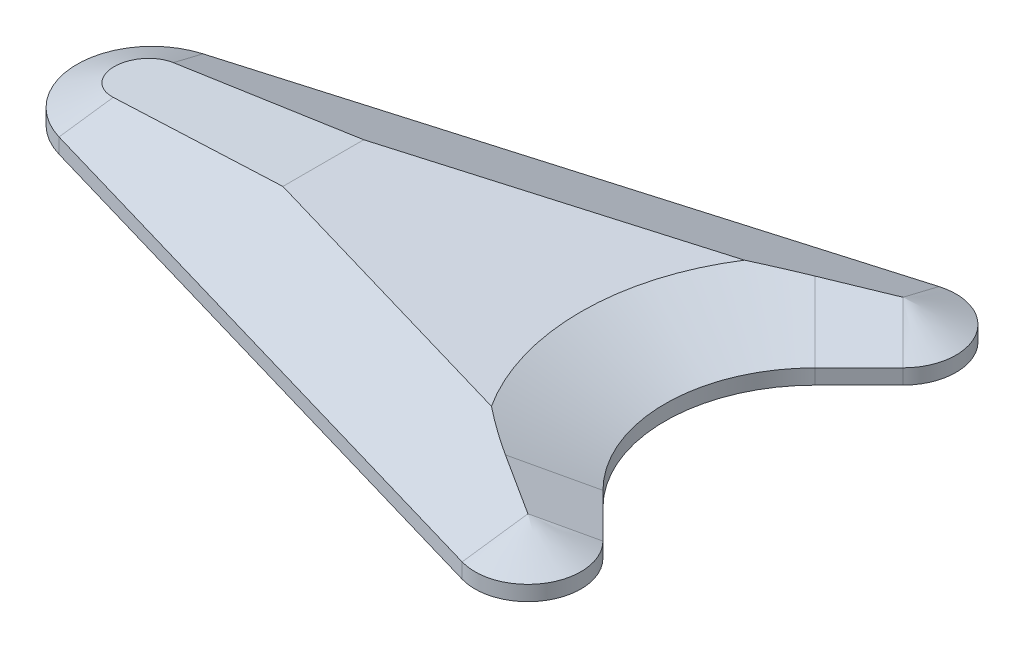
ISO-10303-21;
HEADER;
FILE_DESCRIPTION(('STEP AP214'),'2;1');
FILE_NAME('part.step','',(''),(''),'','','');
FILE_SCHEMA(('AUTOMOTIVE_DESIGN { 1 0 10303 214 1 1 1 1 }'));
ENDSEC;
DATA;
#1=APPLICATION_CONTEXT('core data for automotive mechanical design processes');
#2=APPLICATION_PROTOCOL_DEFINITION('international standard','automotive_design',2000,#1);
#3=PRODUCT_CONTEXT('',#1,'mechanical');
#4=PRODUCT('Part','Part','',(#3));
#5=PRODUCT_RELATED_PRODUCT_CATEGORY('part','',(#4));
#6=PRODUCT_DEFINITION_FORMATION('','',#4);
#7=PRODUCT_DEFINITION_CONTEXT('part definition',#1,'design');
#8=PRODUCT_DEFINITION('design','',#6,#7);
#9=PRODUCT_DEFINITION_SHAPE('','',#8);
#10=(LENGTH_UNIT() NAMED_UNIT(*) SI_UNIT(.MILLI.,.METRE.));
#11=(NAMED_UNIT(*) PLANE_ANGLE_UNIT() SI_UNIT($,.RADIAN.));
#12=(NAMED_UNIT(*) SI_UNIT($,.STERADIAN.) SOLID_ANGLE_UNIT());
#13=UNCERTAINTY_MEASURE_WITH_UNIT(LENGTH_MEASURE(1.E-05),#10,'distance_accuracy_value','');
#14=(GEOMETRIC_REPRESENTATION_CONTEXT(3) GLOBAL_UNCERTAINTY_ASSIGNED_CONTEXT((#13)) GLOBAL_UNIT_ASSIGNED_CONTEXT((#10,
#11,#12)) REPRESENTATION_CONTEXT('',''));
#15=CARTESIAN_POINT('',(0.,0.,0.));
#16=DIRECTION('',(0.,0.,1.));
#17=DIRECTION('',(1.,0.,0.));
#18=AXIS2_PLACEMENT_3D('',#15,#16,#17);
#19=CARTESIAN_POINT('',(53.2842712474619,-60.,0.));
#20=DIRECTION('',(0.,1.,0.));
#21=DIRECTION('',(0.,0.,1.));
#22=AXIS2_PLACEMENT_3D('',#19,#20,#21);
#23=CONICAL_SURFACE('',#22,20.,1.15191730631626);
#24=CARTESIAN_POINT('',(53.2842712474619,-60.,0.));
#25=DIRECTION('',(0.,-1.,0.));
#26=DIRECTION('',(0.,0.,1.));
#27=AXIS2_PLACEMENT_3D('',#24,#25,#26);
#28=CIRCLE('',#27,20.);
#29=CARTESIAN_POINT('',(39.1421356237309,-60.,14.1421356237309));
#30=VERTEX_POINT('',#29);
#31=CARTESIAN_POINT('',(39.142135623731,-60.,-14.1421356237309));
#32=VERTEX_POINT('',#31);
#33=EDGE_CURVE('E214',#30,#32,#28,.T.);
#34=ORIENTED_EDGE('',*,*,#33,.T.);
#35=DIRECTION('',(0.645974188021252,-0.406736643075799,0.645974188021251));
#36=VECTOR('',#35,1.);
#37=CARTESIAN_POINT('',(39.142135623731,-60.,-14.142135623731));
#38=LINE('',#37,#36);
#39=CARTESIAN_POINT('',(32.6430159087823,-55.9078393768281,-20.6412553386797));
#40=VERTEX_POINT('',#39);
#41=EDGE_CURVE('E220',#40,#32,#38,.T.);
#42=ORIENTED_EDGE('',*,*,#41,.F.);
#43=CARTESIAN_POINT('',(32.6430159087823,-55.9078393768281,-20.6412553386797));
#44=CARTESIAN_POINT('',(32.1545509946814,-55.8451711070328,-20.3518645541273));
#45=CARTESIAN_POINT('',(31.6705197188067,-55.7790804420419,-20.0557611073394));
#46=CARTESIAN_POINT('',(30.7118824899162,-55.640360342523,-19.4510080550057));
#47=CARTESIAN_POINT('',(30.2372690154023,-55.567736405331,-19.1423691150541));
#48=CARTESIAN_POINT('',(29.2972429077265,-55.4161556918258,-18.5129613476467));
#49=CARTESIAN_POINT('',(28.831829641351,-55.3371993532514,-18.1921933594423));
#50=CARTESIAN_POINT('',(27.9098655957101,-55.1731376492974,-17.5388587328563));
#51=CARTESIAN_POINT('',(27.4533225348792,-55.088027208426,-17.2062824735404));
#52=CARTESIAN_POINT('',(27.001450685154,-55.,-16.8682461392293));
#53=B_SPLINE_CURVE_WITH_KNOTS('',3,(#43,#44,#45,#46,#47,#48,#49,#50,#51,#52),.UNSPECIFIED.,.F.,
.F.,(4,2,2,2,4),(0.,1.71351909201226,3.4256096161592,5.1375818907686,6.85098255398824),.UNSPECIFIED.);
#54=CARTESIAN_POINT('',(27.001450685154,-55.,-16.8682461392293));
#55=VERTEX_POINT('',#54);
#56=EDGE_CURVE('E156',#40,#55,#53,.T.);
#57=ORIENTED_EDGE('',*,*,#56,.T.);
#58=CARTESIAN_POINT('',(53.2842712474619,-55.,0.));
#59=DIRECTION('',(0.,1.,0.));
#60=DIRECTION('',(0.,0.,1.));
#61=AXIS2_PLACEMENT_3D('',#58,#59,#60);
#62=CIRCLE('',#61,31.2301838695211);
#63=CARTESIAN_POINT('',(27.001450685154,-55.,16.8682461392293));
#64=VERTEX_POINT('',#63);
#65=EDGE_CURVE('E141',#64,#55,#62,.F.);
#66=ORIENTED_EDGE('',*,*,#65,.F.);
#67=CARTESIAN_POINT('',(32.6430159087822,-55.9078393768281,20.6412553386797));
#68=CARTESIAN_POINT('',(32.1545509946812,-55.8451711070328,20.3518645541273));
#69=CARTESIAN_POINT('',(31.6705197188066,-55.7790804420419,20.0557611073394));
#70=CARTESIAN_POINT('',(30.7118824899161,-55.640360342523,19.4510080550057));
#71=CARTESIAN_POINT('',(30.2372690154022,-55.567736405331,19.1423691150541));
#72=CARTESIAN_POINT('',(29.2972429077264,-55.4161556918258,18.5129613476467));
#73=CARTESIAN_POINT('',(28.831829641351,-55.3371993532514,18.1921933594423));
#74=CARTESIAN_POINT('',(27.9098655957101,-55.1731376492974,17.5388587328563));
#75=CARTESIAN_POINT('',(27.4533225348792,-55.088027208426,17.2062824735404));
#76=CARTESIAN_POINT('',(27.001450685154,-55.,16.8682461392293));
#77=B_SPLINE_CURVE_WITH_KNOTS('',3,(#67,#68,#69,#70,#71,#72,#73,#74,#75,#76),.UNSPECIFIED.,.F.,
.F.,(4,2,2,2,4),(0.,1.71351909201223,3.42560961615913,5.13758189076849,6.85098255398811),.UNSPECIFIED.);
#78=CARTESIAN_POINT('',(32.6430159087822,-55.9078393768281,20.6412553386797));
#79=VERTEX_POINT('',#78);
#80=EDGE_CURVE('E42',#79,#64,#77,.T.);
#81=ORIENTED_EDGE('',*,*,#80,.F.);
#82=DIRECTION('',(0.645974188021248,-0.406736643075799,-0.645974188021255));
#83=VECTOR('',#82,1.);
#84=CARTESIAN_POINT('',(39.142135623731,-60.,14.142135623731));
#85=LINE('',#84,#83);
#86=EDGE_CURVE('E144',#79,#30,#85,.T.);
#87=ORIENTED_EDGE('',*,*,#86,.T.);
#88=EDGE_LOOP('',(#34,#42,#57,#66,#81,#87));
#89=FACE_BOUND('',#88,.T.);
#90=ADVANCED_FACE('F34',(#89),#23,.F.);
#91=CARTESIAN_POINT('',(45.,-60.,-20.));
#92=DIRECTION('',(0.28760623847595,0.913545457642601,0.28760623847595));
#93=DIRECTION('',(-0.953846680434026,0.300294039609496,0.));
#94=AXIS2_PLACEMENT_3D('',#91,#92,#93);
#95=PLANE('',#94);
#96=DIRECTION('',(0.707106781186547,0.,-0.707106781186548));
#97=VECTOR('',#96,1.);
#98=CARTESIAN_POINT('',(45.,-60.,-20.));
#99=LINE('',#98,#97);
#100=CARTESIAN_POINT('',(45.,-60.,-20.));
#101=VERTEX_POINT('',#100);
#102=EDGE_CURVE('E240',#32,#101,#99,.T.);
#103=ORIENTED_EDGE('',*,*,#102,.T.);
#104=DIRECTION('',(0.645974188021251,-0.406736643075799,0.645974188021251));
#105=VECTOR('',#104,1.);
#106=CARTESIAN_POINT('',(45.,-60.,-20.));
#107=LINE('',#106,#105);
#108=CARTESIAN_POINT('',(40.,-56.8517577743956,-25.));
#109=VERTEX_POINT('',#108);
#110=EDGE_CURVE('E231',#109,#101,#107,.T.);
#111=ORIENTED_EDGE('',*,*,#110,.F.);
#112=DIRECTION('',(0.855146218786732,-0.109717275246884,-0.506642935416211));
#113=VECTOR('',#112,1.);
#114=CARTESIAN_POINT('',(41.7854879892184,-57.0808400913835,-26.0578364917423));
#115=LINE('',#114,#113);
#116=EDGE_CURVE('E229',#40,#109,#115,.T.);
#117=ORIENTED_EDGE('',*,*,#116,.F.);
#118=ORIENTED_EDGE('',*,*,#41,.T.);
#119=EDGE_LOOP('',(#103,#111,#117,#118));
#120=FACE_BOUND('',#119,.T.);
#121=ADVANCED_FACE('F36',(#120),#95,.T.);
#122=CARTESIAN_POINT('',(40.,-60.,-25.));
#123=DIRECTION('',(0.,-1.,0.));
#124=DIRECTION('',(0.,0.,1.));
#125=AXIS2_PLACEMENT_3D('',#122,#123,#124);
#126=CONICAL_SURFACE('',#125,7.07106781186547,1.15191730631626);
#127=DIRECTION('',(-0.256254702071103,-0.406736643075799,-0.876868764893516));
#128=VECTOR('',#127,1.);
#129=CARTESIAN_POINT('',(38.016525220179,-60.,-31.7871811378373));
#130=LINE('',#129,#128);
#131=CARTESIAN_POINT('',(38.016525220179,-60.,-31.7871811378372));
#132=VERTEX_POINT('',#131);
#133=EDGE_CURVE('E228',#109,#132,#130,.T.);
#134=ORIENTED_EDGE('',*,*,#133,.F.);
#135=ORIENTED_EDGE('',*,*,#110,.T.);
#136=CARTESIAN_POINT('',(40.,-60.,-25.));
#137=DIRECTION('',(0.,1.,0.));
#138=DIRECTION('',(0.,0.,1.));
#139=AXIS2_PLACEMENT_3D('',#136,#137,#138);
#140=CIRCLE('',#139,7.07106781186547);
#141=EDGE_CURVE('E243',#101,#132,#140,.T.);
#142=ORIENTED_EDGE('',*,*,#141,.T.);
#143=EDGE_LOOP('',(#134,#135,#142));
#144=FACE_BOUND('',#143,.T.);
#145=ADVANCED_FACE('F175',(#144),#126,.T.);
#146=CARTESIAN_POINT('',(38.016525220179,-60.,-31.7871811378373));
#147=DIRECTION('',(-0.114091944107248,0.913545457642601,-0.390407127381659));
#148=DIRECTION('',(0.,0.392973165535399,0.919549939464458));
#149=AXIS2_PLACEMENT_3D('',#146,#147,#148);
#150=PLANE('',#149);
#151=DIRECTION('',(-0.256254702071103,-0.406736643075799,-0.876868764893516));
#152=VECTOR('',#151,1.);
#153=CARTESIAN_POINT('',(-37.9100453327991,-60.,-9.5985236154123));
#154=LINE('',#153,#152);
#155=CARTESIAN_POINT('',(-36.2764970539792,-57.4071736523879,-4.00874340819776));
#156=VERTEX_POINT('',#155);
#157=CARTESIAN_POINT('',(-37.9100453327991,-60.,-9.59852361541229));
#158=VERTEX_POINT('',#157);
#159=EDGE_CURVE('E136',#156,#158,#154,.T.);
#160=ORIENTED_EDGE('',*,*,#159,.F.);
#161=DIRECTION('',(-0.99338106693742,-0.0996400462277655,0.0571482024039409));
#162=VECTOR('',#161,1.);
#163=CARTESIAN_POINT('',(38.3566399013138,-49.9211751127992,-8.30231186718958));
#164=LINE('',#163,#162);
#165=CARTESIAN_POINT('',(-12.2777051862331,-55.,-5.38936949495851));
#166=VERTEX_POINT('',#165);
#167=EDGE_CURVE('E128',#156,#166,#164,.F.);
#168=ORIENTED_EDGE('',*,*,#167,.T.);
#169=DIRECTION('',(0.959852361541231,0.,-0.280505693424788));
#170=VECTOR('',#169,1.);
#171=CARTESIAN_POINT('',(41.1666557337869,-55.,-21.0078626301352));
#172=LINE('',#171,#170);
#173=EDGE_CURVE('E134',#55,#166,#172,.F.);
#174=ORIENTED_EDGE('',*,*,#173,.F.);
#175=ORIENTED_EDGE('',*,*,#56,.F.);
#176=ORIENTED_EDGE('',*,*,#116,.T.);
#177=ORIENTED_EDGE('',*,*,#133,.T.);
#178=DIRECTION('',(-0.959852361541232,0.,0.280505693424788));
#179=VECTOR('',#178,1.);
#180=CARTESIAN_POINT('',(38.016525220179,-60.,-31.7871811378373));
#181=LINE('',#180,#179);
#182=EDGE_CURVE('E245',#132,#158,#181,.T.);
#183=ORIENTED_EDGE('',*,*,#182,.T.);
#184=EDGE_LOOP('',(#160,#168,#174,#175,#176,#177,#183));
#185=FACE_BOUND('',#184,.T.);
#186=ADVANCED_FACE('F133',(#185),#150,.T.);
#187=CARTESIAN_POINT('',(-35.1049883985512,-60.,0.));
#188=DIRECTION('',(0.,-1.,0.));
#189=DIRECTION('',(0.,0.,1.));
#190=AXIS2_PLACEMENT_3D('',#187,#188,#189);
#191=CONICAL_SURFACE('',#190,9.99999999999999,1.15191730631626);
#192=DIRECTION('',(-0.256254702071103,-0.406736643075799,0.876868764893516));
#193=VECTOR('',#192,1.);
#194=CARTESIAN_POINT('',(-37.9100453327991,-60.,9.59852361541232));
#195=LINE('',#194,#193);
#196=CARTESIAN_POINT('',(-36.2764970539792,-57.4071736523879,4.00874340819778));
#197=VERTEX_POINT('',#196);
#198=CARTESIAN_POINT('',(-37.9100453327991,-60.,9.59852361541231));
#199=VERTEX_POINT('',#198);
#200=EDGE_CURVE('E225',#197,#199,#195,.T.);
#201=ORIENTED_EDGE('',*,*,#200,.F.);
#202=CARTESIAN_POINT('',(-36.0335474732541,-57.382804849458,0.));
#203=DIRECTION('',(0.0998031539211447,-0.995007201213837,0.));
#204=DIRECTION('',(-0.995007201213837,-0.0998031539211447,0.));
#205=AXIS2_PLACEMENT_3D('',#202,#203,#204);
#206=ELLIPSE('',#205,4.1423654445624,4.01572564866542);
#207=EDGE_CURVE('E138',#197,#156,#206,.T.);
#208=ORIENTED_EDGE('',*,*,#207,.T.);
#209=ORIENTED_EDGE('',*,*,#159,.T.);
#210=CARTESIAN_POINT('',(-35.1049883985512,-60.,0.));
#211=DIRECTION('',(0.,1.,0.));
#212=DIRECTION('',(0.,0.,1.));
#213=AXIS2_PLACEMENT_3D('',#210,#211,#212);
#214=CIRCLE('',#213,9.99999999999999);
#215=EDGE_CURVE('E252',#158,#199,#214,.T.);
#216=ORIENTED_EDGE('',*,*,#215,.T.);
#217=EDGE_LOOP('',(#201,#208,#209,#216));
#218=FACE_BOUND('',#217,.T.);
#219=ADVANCED_FACE('F174',(#218),#191,.T.);
#220=CARTESIAN_POINT('',(38.016525220179,-60.,31.7871811378373));
#221=DIRECTION('',(-0.114091944107248,0.913545457642601,0.390407127381659));
#222=DIRECTION('',(0.,-0.392973165535398,0.919549939464458));
#223=AXIS2_PLACEMENT_3D('',#220,#221,#222);
#224=PLANE('',#223);
#225=DIRECTION('',(-0.959852361541231,0.,-0.280505693424788));
#226=VECTOR('',#225,1.);
#227=CARTESIAN_POINT('',(41.1666557337869,-55.,21.0078626301352));
#228=LINE('',#227,#226);
#229=CARTESIAN_POINT('',(-12.2777051862331,-55.,5.38936949495851));
#230=VERTEX_POINT('',#229);
#231=EDGE_CURVE('E55',#230,#64,#228,.F.);
#232=ORIENTED_EDGE('',*,*,#231,.F.);
#233=DIRECTION('',(0.99338106693742,0.0996400462277655,0.057148202403941));
#234=VECTOR('',#233,1.);
#235=CARTESIAN_POINT('',(38.3566399013138,-49.9211751127992,8.30231186718959));
#236=LINE('',#235,#234);
#237=EDGE_CURVE('E48',#230,#197,#236,.F.);
#238=ORIENTED_EDGE('',*,*,#237,.T.);
#239=ORIENTED_EDGE('',*,*,#200,.T.);
#240=DIRECTION('',(0.959852361541231,0.,0.280505693424788));
#241=VECTOR('',#240,1.);
#242=CARTESIAN_POINT('',(38.016525220179,-60.,31.7871811378373));
#243=LINE('',#242,#241);
#244=CARTESIAN_POINT('',(38.016525220179,-60.,31.7871811378372));
#245=VERTEX_POINT('',#244);
#246=EDGE_CURVE('E255',#199,#245,#243,.T.);
#247=ORIENTED_EDGE('',*,*,#246,.T.);
#248=DIRECTION('',(-0.256254702071103,-0.406736643075799,0.876868764893516));
#249=VECTOR('',#248,1.);
#250=CARTESIAN_POINT('',(38.016525220179,-60.,31.7871811378373));
#251=LINE('',#250,#249);
#252=CARTESIAN_POINT('',(40.,-56.8517577743956,25.));
#253=VERTEX_POINT('',#252);
#254=EDGE_CURVE('E221',#253,#245,#251,.T.);
#255=ORIENTED_EDGE('',*,*,#254,.F.);
#256=DIRECTION('',(0.855146218786732,-0.109717275246884,0.506642935416211));
#257=VECTOR('',#256,1.);
#258=CARTESIAN_POINT('',(41.7854879892184,-57.0808400913835,26.0578364917423));
#259=LINE('',#258,#257);
#260=EDGE_CURVE('E216',#79,#253,#259,.T.);
#261=ORIENTED_EDGE('',*,*,#260,.F.);
#262=ORIENTED_EDGE('',*,*,#80,.T.);
#263=EDGE_LOOP('',(#232,#238,#239,#247,#255,#261,#262));
#264=FACE_BOUND('',#263,.T.);
#265=ADVANCED_FACE('F163',(#264),#224,.T.);
#266=CARTESIAN_POINT('',(40.,-60.,25.));
#267=DIRECTION('',(0.,-1.,0.));
#268=DIRECTION('',(0.,0.,-1.));
#269=AXIS2_PLACEMENT_3D('',#266,#267,#268);
#270=CONICAL_SURFACE('',#269,7.07106781186547,1.15191730631626);
#271=DIRECTION('',(0.645974188021252,-0.406736643075799,-0.64597418802125));
#272=VECTOR('',#271,1.);
#273=CARTESIAN_POINT('',(45.,-60.,20.));
#274=LINE('',#273,#272);
#275=CARTESIAN_POINT('',(45.,-60.,20.));
#276=VERTEX_POINT('',#275);
#277=EDGE_CURVE('E206',#253,#276,#274,.T.);
#278=ORIENTED_EDGE('',*,*,#277,.F.);
#279=ORIENTED_EDGE('',*,*,#254,.T.);
#280=CARTESIAN_POINT('',(40.,-60.,25.));
#281=DIRECTION('',(0.,1.,0.));
#282=DIRECTION('',(0.,0.,-1.));
#283=AXIS2_PLACEMENT_3D('',#280,#281,#282);
#284=CIRCLE('',#283,7.07106781186547);
#285=EDGE_CURVE('E209',#245,#276,#284,.T.);
#286=ORIENTED_EDGE('',*,*,#285,.T.);
#287=EDGE_LOOP('',(#278,#279,#286));
#288=FACE_BOUND('',#287,.T.);
#289=ADVANCED_FACE('F189',(#288),#270,.T.);
#290=CARTESIAN_POINT('',(45.,-60.,20.));
#291=DIRECTION('',(0.28760623847595,0.913545457642601,-0.28760623847595));
#292=DIRECTION('',(-0.953846680434026,0.300294039609496,0.));
#293=AXIS2_PLACEMENT_3D('',#290,#291,#292);
#294=PLANE('',#293);
#295=DIRECTION('',(-0.707106781186546,0.,-0.707106781186548));
#296=VECTOR('',#295,1.);
#297=CARTESIAN_POINT('',(45.,-60.,20.));
#298=LINE('',#297,#296);
#299=EDGE_CURVE('E145',#276,#30,#298,.T.);
#300=ORIENTED_EDGE('',*,*,#299,.T.);
#301=ORIENTED_EDGE('',*,*,#86,.F.);
#302=ORIENTED_EDGE('',*,*,#260,.T.);
#303=ORIENTED_EDGE('',*,*,#277,.T.);
#304=EDGE_LOOP('',(#300,#301,#302,#303));
#305=FACE_BOUND('',#304,.T.);
#306=ADVANCED_FACE('F191',(#305),#294,.T.);
#307=CARTESIAN_POINT('',(53.2842712474619,-55.,0.));
#308=DIRECTION('',(0.,1.,0.));
#309=DIRECTION('',(0.,0.,1.));
#310=AXIS2_PLACEMENT_3D('',#307,#308,#309);
#311=PLANE('',#310);
#312=DIRECTION('',(0.,0.,-1.));
#313=VECTOR('',#312,1.);
#314=CARTESIAN_POINT('',(-12.2777051862331,-55.,0.));
#315=LINE('',#314,#313);
#316=EDGE_CURVE('E11',#230,#166,#315,.T.);
#317=ORIENTED_EDGE('',*,*,#316,.F.);
#318=ORIENTED_EDGE('',*,*,#231,.T.);
#319=ORIENTED_EDGE('',*,*,#65,.T.);
#320=ORIENTED_EDGE('',*,*,#173,.T.);
#321=EDGE_LOOP('',(#317,#318,#319,#320));
#322=FACE_BOUND('',#321,.T.);
#323=ADVANCED_FACE('F140',(#322),#311,.T.);
#324=CARTESIAN_POINT('',(53.2842712474619,-62.,0.));
#325=DIRECTION('',(0.,1.,0.));
#326=DIRECTION('',(0.,0.,1.));
#327=AXIS2_PLACEMENT_3D('',#324,#325,#326);
#328=CYLINDRICAL_SURFACE('',#327,20.);
#329=ORIENTED_EDGE('',*,*,#33,.F.);
#330=DIRECTION('',(0.,1.,0.));
#331=VECTOR('',#330,1.);
#332=CARTESIAN_POINT('',(39.1421356237309,-62.,14.1421356237309));
#333=LINE('',#332,#331);
#334=CARTESIAN_POINT('',(39.1421356237309,-62.,14.1421356237309));
#335=VERTEX_POINT('',#334);
#336=EDGE_CURVE('E247',#335,#30,#333,.T.);
#337=ORIENTED_EDGE('',*,*,#336,.F.);
#338=CARTESIAN_POINT('',(53.2842712474619,-62.,0.));
#339=DIRECTION('',(0.,-1.,0.));
#340=DIRECTION('',(0.,0.,1.));
#341=AXIS2_PLACEMENT_3D('',#338,#339,#340);
#342=CIRCLE('',#341,20.);
#343=CARTESIAN_POINT('',(39.142135623731,-62.,-14.1421356237309));
#344=VERTEX_POINT('',#343);
#345=EDGE_CURVE('E137',#335,#344,#342,.T.);
#346=ORIENTED_EDGE('',*,*,#345,.T.);
#347=DIRECTION('',(0.,1.,0.));
#348=VECTOR('',#347,1.);
#349=CARTESIAN_POINT('',(39.142135623731,-62.,-14.1421356237309));
#350=LINE('',#349,#348);
#351=EDGE_CURVE('E283',#344,#32,#350,.T.);
#352=ORIENTED_EDGE('',*,*,#351,.T.);
#353=EDGE_LOOP('',(#329,#337,#346,#352));
#354=FACE_BOUND('',#353,.T.);
#355=ADVANCED_FACE('F198',(#354),#328,.F.);
#356=CARTESIAN_POINT('',(45.,-62.,20.));
#357=DIRECTION('',(0.707106781186548,0.,-0.707106781186547));
#358=DIRECTION('',(-0.707106781186547,0.,-0.707106781186548));
#359=AXIS2_PLACEMENT_3D('',#356,#357,#358);
#360=PLANE('',#359);
#361=ORIENTED_EDGE('',*,*,#299,.F.);
#362=DIRECTION('',(0.,1.,0.));
#363=VECTOR('',#362,1.);
#364=CARTESIAN_POINT('',(45.,-62.,20.));
#365=LINE('',#364,#363);
#366=CARTESIAN_POINT('',(45.,-62.,20.));
#367=VERTEX_POINT('',#366);
#368=EDGE_CURVE('E265',#367,#276,#365,.T.);
#369=ORIENTED_EDGE('',*,*,#368,.F.);
#370=DIRECTION('',(-0.707106781186547,0.,-0.707106781186548));
#371=VECTOR('',#370,1.);
#372=CARTESIAN_POINT('',(45.,-62.,20.));
#373=LINE('',#372,#371);
#374=EDGE_CURVE('E284',#367,#335,#373,.T.);
#375=ORIENTED_EDGE('',*,*,#374,.T.);
#376=ORIENTED_EDGE('',*,*,#336,.T.);
#377=EDGE_LOOP('',(#361,#369,#375,#376));
#378=FACE_BOUND('',#377,.T.);
#379=ADVANCED_FACE('F326',(#378),#360,.T.);
#380=CARTESIAN_POINT('',(40.,-62.,25.));
#381=DIRECTION('',(0.,1.,0.));
#382=DIRECTION('',(0.,0.,1.));
#383=AXIS2_PLACEMENT_3D('',#380,#381,#382);
#384=CYLINDRICAL_SURFACE('',#383,7.07106781186546);
#385=ORIENTED_EDGE('',*,*,#285,.F.);
#386=DIRECTION('',(0.,1.,0.));
#387=VECTOR('',#386,1.);
#388=CARTESIAN_POINT('',(38.016525220179,-62.,31.7871811378372));
#389=LINE('',#388,#387);
#390=CARTESIAN_POINT('',(38.016525220179,-62.,31.7871811378372));
#391=VERTEX_POINT('',#390);
#392=EDGE_CURVE('E263',#391,#245,#389,.T.);
#393=ORIENTED_EDGE('',*,*,#392,.F.);
#394=CARTESIAN_POINT('',(40.,-62.,25.));
#395=DIRECTION('',(0.,1.,0.));
#396=DIRECTION('',(0.,0.,-1.));
#397=AXIS2_PLACEMENT_3D('',#394,#395,#396);
#398=CIRCLE('',#397,7.07106781186546);
#399=EDGE_CURVE('E266',#391,#367,#398,.T.);
#400=ORIENTED_EDGE('',*,*,#399,.T.);
#401=ORIENTED_EDGE('',*,*,#368,.T.);
#402=EDGE_LOOP('',(#385,#393,#400,#401));
#403=FACE_BOUND('',#402,.T.);
#404=ADVANCED_FACE('F261',(#403),#384,.T.);
#405=CARTESIAN_POINT('',(38.016525220179,-62.,31.7871811378372));
#406=DIRECTION('',(-0.280505693424788,0.,0.959852361541232));
#407=DIRECTION('',(0.959852361541232,0.,0.280505693424788));
#408=AXIS2_PLACEMENT_3D('',#405,#406,#407);
#409=PLANE('',#408);
#410=ORIENTED_EDGE('',*,*,#246,.F.);
#411=DIRECTION('',(0.,1.,0.));
#412=VECTOR('',#411,1.);
#413=CARTESIAN_POINT('',(-37.9100453327991,-62.,9.59852361541231));
#414=LINE('',#413,#412);
#415=CARTESIAN_POINT('',(-37.9100453327991,-62.,9.59852361541231));
#416=VERTEX_POINT('',#415);
#417=EDGE_CURVE('E271',#416,#199,#414,.T.);
#418=ORIENTED_EDGE('',*,*,#417,.F.);
#419=DIRECTION('',(0.959852361541231,0.,0.280505693424788));
#420=VECTOR('',#419,1.);
#421=CARTESIAN_POINT('',(38.016525220179,-62.,31.7871811378372));
#422=LINE('',#421,#420);
#423=EDGE_CURVE('E287',#416,#391,#422,.T.);
#424=ORIENTED_EDGE('',*,*,#423,.T.);
#425=ORIENTED_EDGE('',*,*,#392,.T.);
#426=EDGE_LOOP('',(#410,#418,#424,#425));
#427=FACE_BOUND('',#426,.T.);
#428=ADVANCED_FACE('F333',(#427),#409,.T.);
#429=CARTESIAN_POINT('',(-35.1049883985512,-62.,0.));
#430=DIRECTION('',(0.,1.,0.));
#431=DIRECTION('',(0.,0.,1.));
#432=AXIS2_PLACEMENT_3D('',#429,#430,#431);
#433=CYLINDRICAL_SURFACE('',#432,9.99999999999999);
#434=ORIENTED_EDGE('',*,*,#215,.F.);
#435=DIRECTION('',(0.,1.,0.));
#436=VECTOR('',#435,1.);
#437=CARTESIAN_POINT('',(-37.9100453327991,-62.,-9.59852361541229));
#438=LINE('',#437,#436);
#439=CARTESIAN_POINT('',(-37.9100453327991,-62.,-9.59852361541229));
#440=VERTEX_POINT('',#439);
#441=EDGE_CURVE('E277',#440,#158,#438,.T.);
#442=ORIENTED_EDGE('',*,*,#441,.F.);
#443=CARTESIAN_POINT('',(-35.1049883985512,-62.,0.));
#444=DIRECTION('',(0.,1.,0.));
#445=DIRECTION('',(0.,0.,1.));
#446=AXIS2_PLACEMENT_3D('',#443,#444,#445);
#447=CIRCLE('',#446,9.99999999999999);
#448=EDGE_CURVE('E292',#440,#416,#447,.T.);
#449=ORIENTED_EDGE('',*,*,#448,.T.);
#450=ORIENTED_EDGE('',*,*,#417,.T.);
#451=EDGE_LOOP('',(#434,#442,#449,#450));
#452=FACE_BOUND('',#451,.T.);
#453=ADVANCED_FACE('F310',(#452),#433,.T.);
#454=CARTESIAN_POINT('',(38.016525220179,-62.,-31.7871811378372));
#455=DIRECTION('',(-0.280505693424788,0.,-0.959852361541231));
#456=DIRECTION('',(-0.959852361541231,0.,0.280505693424788));
#457=AXIS2_PLACEMENT_3D('',#454,#455,#456);
#458=PLANE('',#457);
#459=ORIENTED_EDGE('',*,*,#182,.F.);
#460=DIRECTION('',(0.,1.,0.));
#461=VECTOR('',#460,1.);
#462=CARTESIAN_POINT('',(38.016525220179,-62.,-31.7871811378372));
#463=LINE('',#462,#461);
#464=CARTESIAN_POINT('',(38.016525220179,-62.,-31.7871811378372));
#465=VERTEX_POINT('',#464);
#466=EDGE_CURVE('E280',#465,#132,#463,.T.);
#467=ORIENTED_EDGE('',*,*,#466,.F.);
#468=DIRECTION('',(-0.959852361541232,0.,0.280505693424788));
#469=VECTOR('',#468,1.);
#470=CARTESIAN_POINT('',(38.016525220179,-62.,-31.7871811378372));
#471=LINE('',#470,#469);
#472=EDGE_CURVE('E295',#465,#440,#471,.T.);
#473=ORIENTED_EDGE('',*,*,#472,.T.);
#474=ORIENTED_EDGE('',*,*,#441,.T.);
#475=EDGE_LOOP('',(#459,#467,#473,#474));
#476=FACE_BOUND('',#475,.T.);
#477=ADVANCED_FACE('F315',(#476),#458,.T.);
#478=CARTESIAN_POINT('',(40.,-62.,-25.));
#479=DIRECTION('',(0.,1.,0.));
#480=DIRECTION('',(0.,0.,1.));
#481=AXIS2_PLACEMENT_3D('',#478,#479,#480);
#482=CYLINDRICAL_SURFACE('',#481,7.07106781186546);
#483=ORIENTED_EDGE('',*,*,#141,.F.);
#484=DIRECTION('',(0.,1.,0.));
#485=VECTOR('',#484,1.);
#486=CARTESIAN_POINT('',(45.,-62.,-20.));
#487=LINE('',#486,#485);
#488=CARTESIAN_POINT('',(45.,-62.,-20.));
#489=VERTEX_POINT('',#488);
#490=EDGE_CURVE('E282',#489,#101,#487,.T.);
#491=ORIENTED_EDGE('',*,*,#490,.F.);
#492=CARTESIAN_POINT('',(40.,-62.,-25.));
#493=DIRECTION('',(0.,1.,0.));
#494=DIRECTION('',(0.,0.,1.));
#495=AXIS2_PLACEMENT_3D('',#492,#493,#494);
#496=CIRCLE('',#495,7.07106781186546);
#497=EDGE_CURVE('E298',#489,#465,#496,.T.);
#498=ORIENTED_EDGE('',*,*,#497,.T.);
#499=ORIENTED_EDGE('',*,*,#466,.T.);
#500=EDGE_LOOP('',(#483,#491,#498,#499));
#501=FACE_BOUND('',#500,.T.);
#502=ADVANCED_FACE('F324',(#501),#482,.T.);
#503=CARTESIAN_POINT('',(45.,-62.,-20.));
#504=DIRECTION('',(0.707106781186548,0.,0.707106781186547));
#505=DIRECTION('',(0.707106781186547,0.,-0.707106781186548));
#506=AXIS2_PLACEMENT_3D('',#503,#504,#505);
#507=PLANE('',#506);
#508=ORIENTED_EDGE('',*,*,#102,.F.);
#509=ORIENTED_EDGE('',*,*,#351,.F.);
#510=DIRECTION('',(0.707106781186547,0.,-0.707106781186548));
#511=VECTOR('',#510,1.);
#512=CARTESIAN_POINT('',(45.,-62.,-20.));
#513=LINE('',#512,#511);
#514=EDGE_CURVE('E301',#344,#489,#513,.T.);
#515=ORIENTED_EDGE('',*,*,#514,.T.);
#516=ORIENTED_EDGE('',*,*,#490,.T.);
#517=EDGE_LOOP('',(#508,#509,#515,#516));
#518=FACE_BOUND('',#517,.T.);
#519=ADVANCED_FACE('F325',(#518),#507,.T.);
#520=CARTESIAN_POINT('',(53.2842712474619,-62.,0.));
#521=DIRECTION('',(0.,1.,0.));
#522=DIRECTION('',(0.,0.,1.));
#523=AXIS2_PLACEMENT_3D('',#520,#521,#522);
#524=PLANE('',#523);
#525=ORIENTED_EDGE('',*,*,#345,.F.);
#526=ORIENTED_EDGE('',*,*,#374,.F.);
#527=ORIENTED_EDGE('',*,*,#399,.F.);
#528=ORIENTED_EDGE('',*,*,#423,.F.);
#529=ORIENTED_EDGE('',*,*,#448,.F.);
#530=ORIENTED_EDGE('',*,*,#472,.F.);
#531=ORIENTED_EDGE('',*,*,#497,.F.);
#532=ORIENTED_EDGE('',*,*,#514,.F.);
#533=EDGE_LOOP('',(#525,#526,#527,#528,#529,#530,#531,#532));
#534=FACE_BOUND('',#533,.T.);
#535=ADVANCED_FACE('F320',(#534),#524,.F.);
#536=CARTESIAN_POINT('',(-54.1714276861527,-59.2021059042473,-32.0710678118655));
#537=DIRECTION('',(0.0998031539211447,-0.995007201213837,0.));
#538=DIRECTION('',(0.995007201213837,0.0998031539211447,0.));
#539=AXIS2_PLACEMENT_3D('',#536,#537,#538);
#540=PLANE('',#539);
#541=ORIENTED_EDGE('',*,*,#207,.F.);
#542=ORIENTED_EDGE('',*,*,#237,.F.);
#543=ORIENTED_EDGE('',*,*,#316,.T.);
#544=ORIENTED_EDGE('',*,*,#167,.F.);
#545=EDGE_LOOP('',(#541,#542,#543,#544));
#546=FACE_BOUND('',#545,.T.);
#547=ADVANCED_FACE('F127',(#546),#540,.F.);
#548=CLOSED_SHELL('',(#90,#121,#145,#186,#219,#265,#289,#306,#323,#355,#379,#404,#428,#453,#477,
#502,#519,#535,#547));
#549=MANIFOLD_SOLID_BREP('B2',#548);
#550=ADVANCED_BREP_SHAPE_REPRESENTATION('',(#18,#549),#14);
#551=SHAPE_DEFINITION_REPRESENTATION(#9,#550);
ENDSEC;
END-ISO-10303-21;
